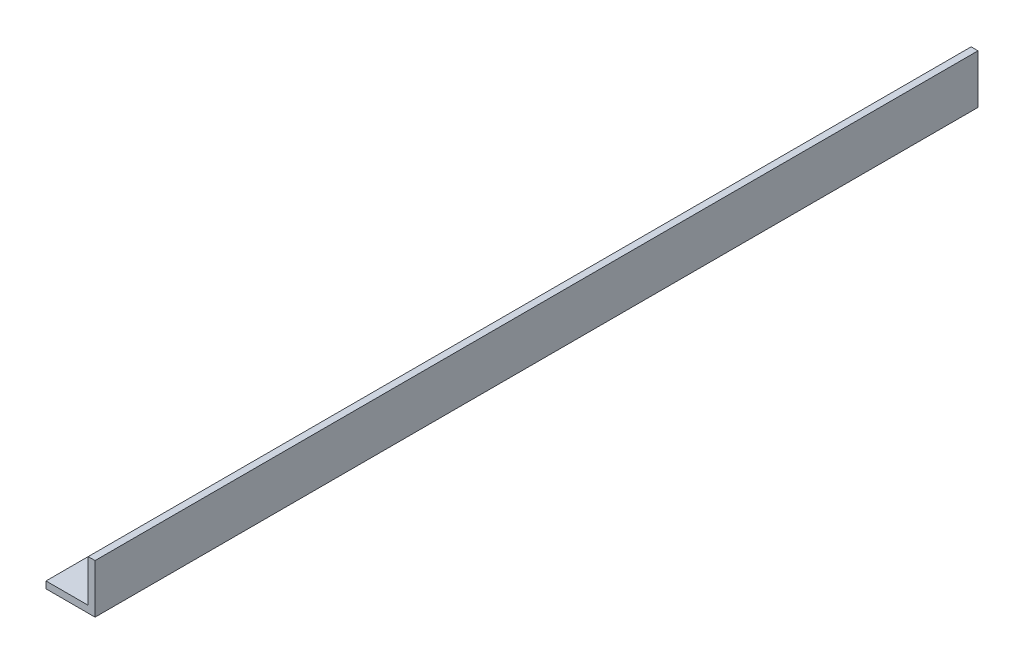
ISO-10303-21;
HEADER;
FILE_DESCRIPTION(('STEP AP214'),'2;1');
FILE_NAME('part.step','',(''),(''),'','','');
FILE_SCHEMA(('AUTOMOTIVE_DESIGN { 1 0 10303 214 1 1 1 1 }'));
ENDSEC;
DATA;
#1=APPLICATION_CONTEXT('core data for automotive mechanical design processes');
#2=APPLICATION_PROTOCOL_DEFINITION('international standard','automotive_design',2000,#1);
#3=PRODUCT_CONTEXT('',#1,'mechanical');
#4=PRODUCT('Part','Part','',(#3));
#5=PRODUCT_RELATED_PRODUCT_CATEGORY('part','',(#4));
#6=PRODUCT_DEFINITION_FORMATION('','',#4);
#7=PRODUCT_DEFINITION_CONTEXT('part definition',#1,'design');
#8=PRODUCT_DEFINITION('design','',#6,#7);
#9=PRODUCT_DEFINITION_SHAPE('','',#8);
#10=(LENGTH_UNIT() NAMED_UNIT(*) SI_UNIT(.MILLI.,.METRE.));
#11=(NAMED_UNIT(*) PLANE_ANGLE_UNIT() SI_UNIT($,.RADIAN.));
#12=(NAMED_UNIT(*) SI_UNIT($,.STERADIAN.) SOLID_ANGLE_UNIT());
#13=UNCERTAINTY_MEASURE_WITH_UNIT(LENGTH_MEASURE(1.E-05),#10,'distance_accuracy_value','');
#14=(GEOMETRIC_REPRESENTATION_CONTEXT(3) GLOBAL_UNCERTAINTY_ASSIGNED_CONTEXT((#13)) GLOBAL_UNIT_ASSIGNED_CONTEXT((#10,
#11,#12)) REPRESENTATION_CONTEXT('',''));
#15=CARTESIAN_POINT('',(0.,0.,0.));
#16=DIRECTION('',(0.,0.,1.));
#17=DIRECTION('',(1.,0.,0.));
#18=AXIS2_PLACEMENT_3D('',#15,#16,#17);
#19=CARTESIAN_POINT('',(0.,7.,900.));
#20=DIRECTION('',(1.,0.,0.));
#21=DIRECTION('',(0.,0.,-1.));
#22=AXIS2_PLACEMENT_3D('',#19,#20,#21);
#23=PLANE('',#22);
#24=DIRECTION('',(0.,-1.,0.));
#25=VECTOR('',#24,1.);
#26=CARTESIAN_POINT('',(0.,7.,0.));
#27=LINE('',#26,#25);
#28=CARTESIAN_POINT('',(0.,7.,0.));
#29=VERTEX_POINT('',#28);
#30=CARTESIAN_POINT('',(0.,0.,0.));
#31=VERTEX_POINT('',#30);
#32=EDGE_CURVE('E117',#29,#31,#27,.T.);
#33=ORIENTED_EDGE('',*,*,#32,.T.);
#34=DIRECTION('',(0.,0.,-1.));
#35=VECTOR('',#34,1.);
#36=CARTESIAN_POINT('',(0.,0.,900.));
#37=LINE('',#36,#35);
#38=CARTESIAN_POINT('',(0.,0.,900.));
#39=VERTEX_POINT('',#38);
#40=EDGE_CURVE('E11',#39,#31,#37,.T.);
#41=ORIENTED_EDGE('',*,*,#40,.F.);
#42=DIRECTION('',(0.,-1.,0.));
#43=VECTOR('',#42,1.);
#44=CARTESIAN_POINT('',(0.,7.,900.));
#45=LINE('',#44,#43);
#46=CARTESIAN_POINT('',(0.,7.,900.));
#47=VERTEX_POINT('',#46);
#48=EDGE_CURVE('E127',#47,#39,#45,.T.);
#49=ORIENTED_EDGE('',*,*,#48,.F.);
#50=DIRECTION('',(0.,0.,-1.));
#51=VECTOR('',#50,1.);
#52=CARTESIAN_POINT('',(0.,7.,900.));
#53=LINE('',#52,#51);
#54=EDGE_CURVE('E113',#47,#29,#53,.T.);
#55=ORIENTED_EDGE('',*,*,#54,.T.);
#56=EDGE_LOOP('',(#33,#41,#49,#55));
#57=FACE_BOUND('',#56,.T.);
#58=ADVANCED_FACE('F33',(#57),#23,.F.);
#59=CARTESIAN_POINT('',(0.,0.,900.));
#60=DIRECTION('',(0.,1.,0.));
#61=DIRECTION('',(0.,0.,1.));
#62=AXIS2_PLACEMENT_3D('',#59,#60,#61);
#63=PLANE('',#62);
#64=DIRECTION('',(1.,0.,0.));
#65=VECTOR('',#64,1.);
#66=CARTESIAN_POINT('',(0.,0.,0.));
#67=LINE('',#66,#65);
#68=CARTESIAN_POINT('',(50.,0.,0.));
#69=VERTEX_POINT('',#68);
#70=EDGE_CURVE('E120',#31,#69,#67,.T.);
#71=ORIENTED_EDGE('',*,*,#70,.T.);
#72=DIRECTION('',(0.,0.,-1.));
#73=VECTOR('',#72,1.);
#74=CARTESIAN_POINT('',(50.,0.,900.));
#75=LINE('',#74,#73);
#76=CARTESIAN_POINT('',(50.,0.,900.));
#77=VERTEX_POINT('',#76);
#78=EDGE_CURVE('E41',#77,#69,#75,.T.);
#79=ORIENTED_EDGE('',*,*,#78,.F.);
#80=DIRECTION('',(1.,0.,0.));
#81=VECTOR('',#80,1.);
#82=CARTESIAN_POINT('',(0.,0.,900.));
#83=LINE('',#82,#81);
#84=EDGE_CURVE('E86',#39,#77,#83,.T.);
#85=ORIENTED_EDGE('',*,*,#84,.F.);
#86=ORIENTED_EDGE('',*,*,#40,.T.);
#87=EDGE_LOOP('',(#71,#79,#85,#86));
#88=FACE_BOUND('',#87,.T.);
#89=ADVANCED_FACE('F151',(#88),#63,.F.);
#90=CARTESIAN_POINT('',(50.,0.,900.));
#91=DIRECTION('',(-1.,0.,0.));
#92=DIRECTION('',(0.,0.,1.));
#93=AXIS2_PLACEMENT_3D('',#90,#91,#92);
#94=PLANE('',#93);
#95=DIRECTION('',(0.,1.,0.));
#96=VECTOR('',#95,1.);
#97=CARTESIAN_POINT('',(50.,0.,0.));
#98=LINE('',#97,#96);
#99=CARTESIAN_POINT('',(50.,50.,0.));
#100=VERTEX_POINT('',#99);
#101=EDGE_CURVE('E122',#69,#100,#98,.T.);
#102=ORIENTED_EDGE('',*,*,#101,.T.);
#103=DIRECTION('',(0.,0.,-1.));
#104=VECTOR('',#103,1.);
#105=CARTESIAN_POINT('',(50.,50.,900.));
#106=LINE('',#105,#104);
#107=CARTESIAN_POINT('',(50.,50.,900.));
#108=VERTEX_POINT('',#107);
#109=EDGE_CURVE('E108',#108,#100,#106,.T.);
#110=ORIENTED_EDGE('',*,*,#109,.F.);
#111=DIRECTION('',(0.,1.,0.));
#112=VECTOR('',#111,1.);
#113=CARTESIAN_POINT('',(50.,0.,900.));
#114=LINE('',#113,#112);
#115=EDGE_CURVE('E99',#77,#108,#114,.T.);
#116=ORIENTED_EDGE('',*,*,#115,.F.);
#117=ORIENTED_EDGE('',*,*,#78,.T.);
#118=EDGE_LOOP('',(#102,#110,#116,#117));
#119=FACE_BOUND('',#118,.T.);
#120=ADVANCED_FACE('F133',(#119),#94,.F.);
#121=CARTESIAN_POINT('',(50.,50.,900.));
#122=DIRECTION('',(0.,-1.,0.));
#123=DIRECTION('',(0.,0.,-1.));
#124=AXIS2_PLACEMENT_3D('',#121,#122,#123);
#125=PLANE('',#124);
#126=DIRECTION('',(-1.,0.,0.));
#127=VECTOR('',#126,1.);
#128=CARTESIAN_POINT('',(50.,50.,0.));
#129=LINE('',#128,#127);
#130=CARTESIAN_POINT('',(43.,50.,0.));
#131=VERTEX_POINT('',#130);
#132=EDGE_CURVE('E107',#100,#131,#129,.T.);
#133=ORIENTED_EDGE('',*,*,#132,.T.);
#134=DIRECTION('',(0.,0.,-1.));
#135=VECTOR('',#134,1.);
#136=CARTESIAN_POINT('',(43.,50.,900.));
#137=LINE('',#136,#135);
#138=CARTESIAN_POINT('',(43.,50.,900.));
#139=VERTEX_POINT('',#138);
#140=EDGE_CURVE('E104',#139,#131,#137,.T.);
#141=ORIENTED_EDGE('',*,*,#140,.F.);
#142=DIRECTION('',(-1.,0.,0.));
#143=VECTOR('',#142,1.);
#144=CARTESIAN_POINT('',(50.,50.,900.));
#145=LINE('',#144,#143);
#146=EDGE_CURVE('E93',#108,#139,#145,.T.);
#147=ORIENTED_EDGE('',*,*,#146,.F.);
#148=ORIENTED_EDGE('',*,*,#109,.T.);
#149=EDGE_LOOP('',(#133,#141,#147,#148));
#150=FACE_BOUND('',#149,.T.);
#151=ADVANCED_FACE('F105',(#150),#125,.F.);
#152=CARTESIAN_POINT('',(43.,50.,900.));
#153=DIRECTION('',(1.,0.,0.));
#154=DIRECTION('',(0.,1.,0.));
#155=AXIS2_PLACEMENT_3D('',#152,#153,#154);
#156=PLANE('',#155);
#157=DIRECTION('',(0.,-1.,0.));
#158=VECTOR('',#157,1.);
#159=CARTESIAN_POINT('',(43.,50.,0.));
#160=LINE('',#159,#158);
#161=CARTESIAN_POINT('',(43.,7.00000000000001,0.));
#162=VERTEX_POINT('',#161);
#163=EDGE_CURVE('E72',#131,#162,#160,.T.);
#164=ORIENTED_EDGE('',*,*,#163,.T.);
#165=DIRECTION('',(0.,0.,-1.));
#166=VECTOR('',#165,1.);
#167=CARTESIAN_POINT('',(43.,7.00000000000001,900.));
#168=LINE('',#167,#166);
#169=CARTESIAN_POINT('',(43.,7.00000000000001,900.));
#170=VERTEX_POINT('',#169);
#171=EDGE_CURVE('E109',#170,#162,#168,.T.);
#172=ORIENTED_EDGE('',*,*,#171,.F.);
#173=DIRECTION('',(0.,-1.,0.));
#174=VECTOR('',#173,1.);
#175=CARTESIAN_POINT('',(43.,50.,900.));
#176=LINE('',#175,#174);
#177=EDGE_CURVE('E97',#139,#170,#176,.T.);
#178=ORIENTED_EDGE('',*,*,#177,.F.);
#179=ORIENTED_EDGE('',*,*,#140,.T.);
#180=EDGE_LOOP('',(#164,#172,#178,#179));
#181=FACE_BOUND('',#180,.T.);
#182=ADVANCED_FACE('F111',(#181),#156,.F.);
#183=CARTESIAN_POINT('',(43.,7.00000000000001,900.));
#184=DIRECTION('',(0.,-1.,0.));
#185=DIRECTION('',(1.,0.,0.));
#186=AXIS2_PLACEMENT_3D('',#183,#184,#185);
#187=PLANE('',#186);
#188=DIRECTION('',(-1.,0.,0.));
#189=VECTOR('',#188,1.);
#190=CARTESIAN_POINT('',(43.,7.00000000000001,0.));
#191=LINE('',#190,#189);
#192=EDGE_CURVE('E78',#162,#29,#191,.T.);
#193=ORIENTED_EDGE('',*,*,#192,.T.);
#194=ORIENTED_EDGE('',*,*,#54,.F.);
#195=DIRECTION('',(-1.,0.,0.));
#196=VECTOR('',#195,1.);
#197=CARTESIAN_POINT('',(43.,7.00000000000001,900.));
#198=LINE('',#197,#196);
#199=EDGE_CURVE('E49',#170,#47,#198,.T.);
#200=ORIENTED_EDGE('',*,*,#199,.F.);
#201=ORIENTED_EDGE('',*,*,#171,.T.);
#202=EDGE_LOOP('',(#193,#194,#200,#201));
#203=FACE_BOUND('',#202,.T.);
#204=ADVANCED_FACE('F140',(#203),#187,.F.);
#205=CARTESIAN_POINT('',(0.,0.,900.));
#206=DIRECTION('',(0.,0.,1.));
#207=DIRECTION('',(1.,0.,0.));
#208=AXIS2_PLACEMENT_3D('',#205,#206,#207);
#209=PLANE('',#208);
#210=ORIENTED_EDGE('',*,*,#48,.T.);
#211=ORIENTED_EDGE('',*,*,#84,.T.);
#212=ORIENTED_EDGE('',*,*,#115,.T.);
#213=ORIENTED_EDGE('',*,*,#146,.T.);
#214=ORIENTED_EDGE('',*,*,#177,.T.);
#215=ORIENTED_EDGE('',*,*,#199,.T.);
#216=EDGE_LOOP('',(#210,#211,#212,#213,#214,#215));
#217=FACE_BOUND('',#216,.T.);
#218=ADVANCED_FACE('F95',(#217),#209,.T.);
#219=CARTESIAN_POINT('',(0.,0.,0.));
#220=DIRECTION('',(0.,0.,1.));
#221=DIRECTION('',(1.,0.,0.));
#222=AXIS2_PLACEMENT_3D('',#219,#220,#221);
#223=PLANE('',#222);
#224=ORIENTED_EDGE('',*,*,#32,.F.);
#225=ORIENTED_EDGE('',*,*,#192,.F.);
#226=ORIENTED_EDGE('',*,*,#163,.F.);
#227=ORIENTED_EDGE('',*,*,#132,.F.);
#228=ORIENTED_EDGE('',*,*,#101,.F.);
#229=ORIENTED_EDGE('',*,*,#70,.F.);
#230=EDGE_LOOP('',(#224,#225,#226,#227,#228,#229));
#231=FACE_BOUND('',#230,.T.);
#232=ADVANCED_FACE('F136',(#231),#223,.F.);
#233=CLOSED_SHELL('',(#58,#89,#120,#151,#182,#204,#218,#232));
#234=MANIFOLD_SOLID_BREP('B2',#233);
#235=ADVANCED_BREP_SHAPE_REPRESENTATION('',(#18,#234),#14);
#236=SHAPE_DEFINITION_REPRESENTATION(#9,#235);
ENDSEC;
END-ISO-10303-21;
